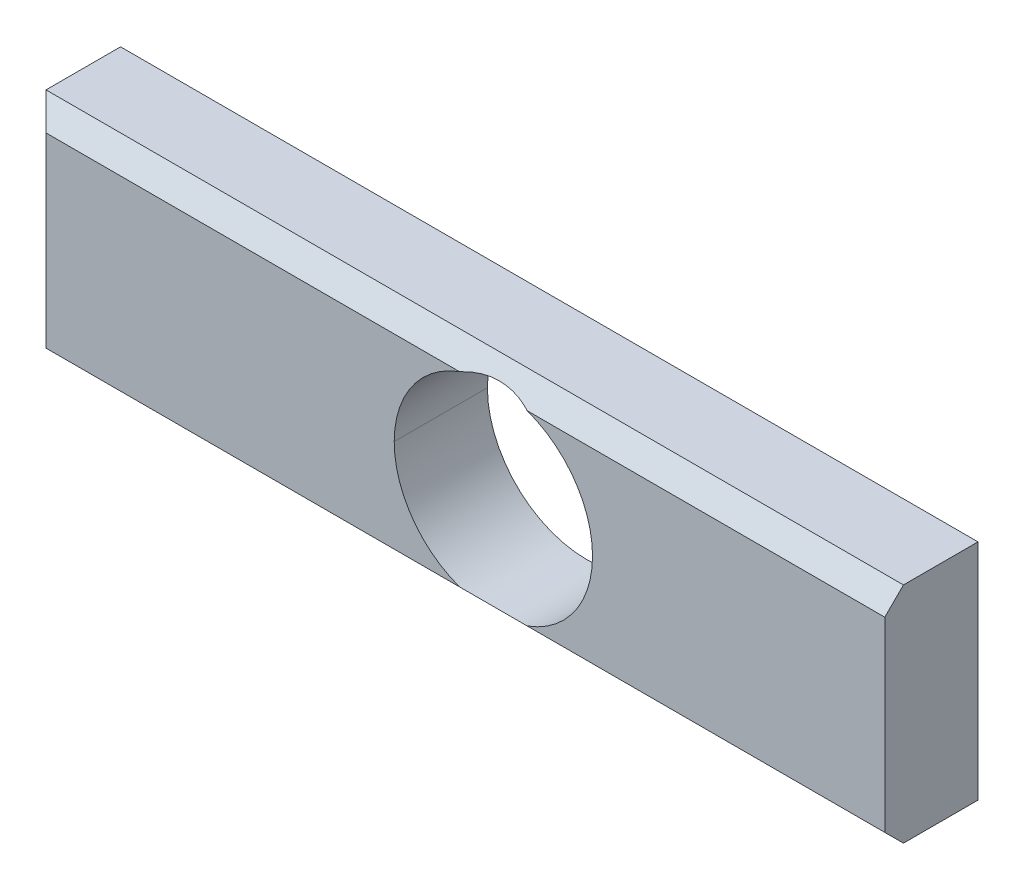
ISO-10303-21;
HEADER;
FILE_DESCRIPTION(('STEP AP214'),'2;1');
FILE_NAME('part.step','',(''),(''),'','','');
FILE_SCHEMA(('AUTOMOTIVE_DESIGN { 1 0 10303 214 1 1 1 1 }'));
ENDSEC;
DATA;
#1=APPLICATION_CONTEXT('core data for automotive mechanical design processes');
#2=APPLICATION_PROTOCOL_DEFINITION('international standard','automotive_design',2000,#1);
#3=PRODUCT_CONTEXT('',#1,'mechanical');
#4=PRODUCT('Part','Part','',(#3));
#5=PRODUCT_RELATED_PRODUCT_CATEGORY('part','',(#4));
#6=PRODUCT_DEFINITION_FORMATION('','',#4);
#7=PRODUCT_DEFINITION_CONTEXT('part definition',#1,'design');
#8=PRODUCT_DEFINITION('design','',#6,#7);
#9=PRODUCT_DEFINITION_SHAPE('','',#8);
#10=(LENGTH_UNIT() NAMED_UNIT(*) SI_UNIT(.MILLI.,.METRE.));
#11=(NAMED_UNIT(*) PLANE_ANGLE_UNIT() SI_UNIT($,.RADIAN.));
#12=(NAMED_UNIT(*) SI_UNIT($,.STERADIAN.) SOLID_ANGLE_UNIT());
#13=UNCERTAINTY_MEASURE_WITH_UNIT(LENGTH_MEASURE(1.E-05),#10,'distance_accuracy_value','');
#14=(GEOMETRIC_REPRESENTATION_CONTEXT(3) GLOBAL_UNCERTAINTY_ASSIGNED_CONTEXT((#13)) GLOBAL_UNIT_ASSIGNED_CONTEXT((#10,
#11,#12)) REPRESENTATION_CONTEXT('',''));
#15=CARTESIAN_POINT('',(0.,0.,0.));
#16=DIRECTION('',(0.,0.,1.));
#17=DIRECTION('',(1.,0.,0.));
#18=AXIS2_PLACEMENT_3D('',#15,#16,#17);
#19=CARTESIAN_POINT('',(0.,0.,7.9375));
#20=DIRECTION('',(0.,0.,-1.));
#21=DIRECTION('',(-1.,0.,0.));
#22=AXIS2_PLACEMENT_3D('',#19,#20,#21);
#23=CYLINDRICAL_SURFACE('',#22,8.4455);
#24=DIRECTION('',(0.,0.,-1.));
#25=VECTOR('',#24,1.);
#26=CARTESIAN_POINT('',(8.4455,0.,7.9375));
#27=LINE('',#26,#25);
#28=CARTESIAN_POINT('',(8.4455,0.,7.9375));
#29=VERTEX_POINT('',#28);
#30=CARTESIAN_POINT('',(8.4455,0.,0.));
#31=VERTEX_POINT('',#30);
#32=EDGE_CURVE('E210',#29,#31,#27,.T.);
#33=ORIENTED_EDGE('',*,*,#32,.F.);
#34=CARTESIAN_POINT('',(0.,0.,7.9375));
#35=DIRECTION('',(0.,0.,1.));
#36=DIRECTION('',(1.,0.,0.));
#37=AXIS2_PLACEMENT_3D('',#34,#35,#36);
#38=CIRCLE('',#37,8.4455);
#39=CARTESIAN_POINT('',(2.88488543966654,7.9375,7.9375));
#40=VERTEX_POINT('',#39);
#41=EDGE_CURVE('E148',#29,#40,#38,.T.);
#42=ORIENTED_EDGE('',*,*,#41,.T.);
#43=CARTESIAN_POINT('',(-2.88488543966654,7.9375,7.9375));
#44=CARTESIAN_POINT('',(-1.00180094902259,8.62190731070496,7.25309268929503));
#45=CARTESIAN_POINT('',(1.00180094902259,8.62190731070496,7.25309268929503));
#46=CARTESIAN_POINT('',(2.88488543966654,7.9375,7.9375));
#47=(BOUNDED_CURVE() B_SPLINE_CURVE(3,(#43,#44,#45,#46),.UNSPECIFIED.,.F.,
.F.) B_SPLINE_CURVE_WITH_KNOTS((4,4),(5.93457879350638,6.63179182085279),
.UNSPECIFIED.) CURVE() GEOMETRIC_REPRESENTATION_ITEM() RATIONAL_B_SPLINE_CURVE((1.,
0.959899749373433,0.959899749373433,1.)) REPRESENTATION_ITEM(''));
#48=CARTESIAN_POINT('',(-2.88488543966654,7.9375,7.9375));
#49=VERTEX_POINT('',#48);
#50=EDGE_CURVE('E142',#49,#40,#47,.T.);
#51=ORIENTED_EDGE('',*,*,#50,.F.);
#52=CARTESIAN_POINT('',(0.,0.,7.9375));
#53=DIRECTION('',(0.,0.,1.));
#54=DIRECTION('',(1.,0.,0.));
#55=AXIS2_PLACEMENT_3D('',#52,#53,#54);
#56=CIRCLE('',#55,8.4455);
#57=CARTESIAN_POINT('',(-8.4455,0.,7.9375));
#58=VERTEX_POINT('',#57);
#59=EDGE_CURVE('E146',#49,#58,#56,.T.);
#60=ORIENTED_EDGE('',*,*,#59,.T.);
#61=DIRECTION('',(0.,0.,-1.));
#62=VECTOR('',#61,1.);
#63=CARTESIAN_POINT('',(-8.4455,0.,7.9375));
#64=LINE('',#63,#62);
#65=CARTESIAN_POINT('',(-8.4455,0.,0.));
#66=VERTEX_POINT('',#65);
#67=EDGE_CURVE('E200',#58,#66,#64,.T.);
#68=ORIENTED_EDGE('',*,*,#67,.T.);
#69=CARTESIAN_POINT('',(0.,0.,0.));
#70=DIRECTION('',(0.,0.,1.));
#71=DIRECTION('',(1.,0.,0.));
#72=AXIS2_PLACEMENT_3D('',#69,#70,#71);
#73=CIRCLE('',#72,8.4455);
#74=EDGE_CURVE('E246',#31,#66,#73,.T.);
#75=ORIENTED_EDGE('',*,*,#74,.F.);
#76=EDGE_LOOP('',(#33,#42,#51,#60,#68,#75));
#77=FACE_BOUND('',#76,.T.);
#78=ADVANCED_FACE('F16',(#77),#23,.F.);
#79=CARTESIAN_POINT('',(-39.6875,-9.525,7.9375));
#80=DIRECTION('',(0.707106781186549,0.707106781186546,0.));
#81=DIRECTION('',(0.,0.,-1.));
#82=AXIS2_PLACEMENT_3D('',#79,#80,#81);
#83=PLANE('',#82);
#84=DIRECTION('',(0.577350269189624,-0.577350269189626,0.577350269189627));
#85=VECTOR('',#84,1.);
#86=CARTESIAN_POINT('',(-41.8041666666667,-7.40833333333333,4.23333333333332));
#87=LINE('',#86,#85);
#88=CARTESIAN_POINT('',(-41.275,-7.9375,4.7625));
#89=VERTEX_POINT('',#88);
#90=CARTESIAN_POINT('',(-39.6875,-9.525,6.35));
#91=VERTEX_POINT('',#90);
#92=EDGE_CURVE('E11',#89,#91,#87,.T.);
#93=ORIENTED_EDGE('',*,*,#92,.F.);
#94=DIRECTION('',(0.,0.,1.));
#95=VECTOR('',#94,1.);
#96=CARTESIAN_POINT('',(-41.275,-7.9375,7.9375));
#97=LINE('',#96,#95);
#98=CARTESIAN_POINT('',(-41.275,-7.9375,0.));
#99=VERTEX_POINT('',#98);
#100=EDGE_CURVE('E236',#99,#89,#97,.T.);
#101=ORIENTED_EDGE('',*,*,#100,.F.);
#102=DIRECTION('',(-0.707106781186546,0.707106781186549,0.));
#103=VECTOR('',#102,1.);
#104=CARTESIAN_POINT('',(-39.6875,-9.525,0.));
#105=LINE('',#104,#103);
#106=CARTESIAN_POINT('',(-39.6875,-9.525,0.));
#107=VERTEX_POINT('',#106);
#108=EDGE_CURVE('E42',#107,#99,#105,.T.);
#109=ORIENTED_EDGE('',*,*,#108,.F.);
#110=DIRECTION('',(0.,0.,-1.));
#111=VECTOR('',#110,1.);
#112=CARTESIAN_POINT('',(-39.6875,-9.525,7.9375));
#113=LINE('',#112,#111);
#114=EDGE_CURVE('E20',#91,#107,#113,.T.);
#115=ORIENTED_EDGE('',*,*,#114,.F.);
#116=EDGE_LOOP('',(#93,#101,#109,#115));
#117=FACE_BOUND('',#116,.T.);
#118=ADVANCED_FACE('F305',(#117),#83,.F.);
#119=CARTESIAN_POINT('',(-41.275,7.9375,7.9375));
#120=DIRECTION('',(0.707106781186545,-0.707106781186551,0.));
#121=DIRECTION('',(0.,0.,-1.));
#122=AXIS2_PLACEMENT_3D('',#119,#120,#121);
#123=PLANE('',#122);
#124=DIRECTION('',(-0.577350269189627,-0.577350269189621,-0.57735026918963));
#125=VECTOR('',#124,1.);
#126=CARTESIAN_POINT('',(-41.8041666666666,7.40833333333337,4.23333333333335));
#127=LINE('',#126,#125);
#128=CARTESIAN_POINT('',(-39.6875,9.525,6.35));
#129=VERTEX_POINT('',#128);
#130=CARTESIAN_POINT('',(-41.275,7.9375,4.7625));
#131=VERTEX_POINT('',#130);
#132=EDGE_CURVE('E27',#129,#131,#127,.T.);
#133=ORIENTED_EDGE('',*,*,#132,.F.);
#134=DIRECTION('',(0.,0.,1.));
#135=VECTOR('',#134,1.);
#136=CARTESIAN_POINT('',(-39.6875,9.525,7.9375));
#137=LINE('',#136,#135);
#138=CARTESIAN_POINT('',(-39.6875,9.525,0.));
#139=VERTEX_POINT('',#138);
#140=EDGE_CURVE('E225',#139,#129,#137,.T.);
#141=ORIENTED_EDGE('',*,*,#140,.F.);
#142=DIRECTION('',(0.707106781186551,0.707106781186545,0.));
#143=VECTOR('',#142,1.);
#144=CARTESIAN_POINT('',(-41.275,7.9375,0.));
#145=LINE('',#144,#143);
#146=CARTESIAN_POINT('',(-41.275,7.9375,0.));
#147=VERTEX_POINT('',#146);
#148=EDGE_CURVE('E79',#147,#139,#145,.T.);
#149=ORIENTED_EDGE('',*,*,#148,.F.);
#150=DIRECTION('',(0.,0.,-1.));
#151=VECTOR('',#150,1.);
#152=CARTESIAN_POINT('',(-41.275,7.9375,7.9375));
#153=LINE('',#152,#151);
#154=EDGE_CURVE('E201',#131,#147,#153,.T.);
#155=ORIENTED_EDGE('',*,*,#154,.F.);
#156=EDGE_LOOP('',(#133,#141,#149,#155));
#157=FACE_BOUND('',#156,.T.);
#158=ADVANCED_FACE('F304',(#157),#123,.F.);
#159=CARTESIAN_POINT('',(-38.1,0.,7.9375));
#160=DIRECTION('',(-0.70710678118655,0.,0.707106781186546));
#161=DIRECTION('',(0.,1.,0.));
#162=AXIS2_PLACEMENT_3D('',#159,#160,#161);
#163=PLANE('',#162);
#164=DIRECTION('',(-0.577350269189625,0.577350269189624,-0.577350269189628));
#165=VECTOR('',#164,1.);
#166=CARTESIAN_POINT('',(-35.4541666666667,5.29166666666669,10.5833333333333));
#167=LINE('',#166,#165);
#168=CARTESIAN_POINT('',(-38.1,7.9375,7.9375));
#169=VERTEX_POINT('',#168);
#170=EDGE_CURVE('E133',#169,#129,#167,.T.);
#171=ORIENTED_EDGE('',*,*,#170,.T.);
#172=ORIENTED_EDGE('',*,*,#132,.T.);
#173=DIRECTION('',(0.,1.,0.));
#174=VECTOR('',#173,1.);
#175=CARTESIAN_POINT('',(-41.275,9.525,4.7625));
#176=LINE('',#175,#174);
#177=EDGE_CURVE('E206',#89,#131,#176,.T.);
#178=ORIENTED_EDGE('',*,*,#177,.F.);
#179=ORIENTED_EDGE('',*,*,#92,.T.);
#180=DIRECTION('',(0.577350269189625,0.577350269189623,0.577350269189629));
#181=VECTOR('',#180,1.);
#182=CARTESIAN_POINT('',(-35.4541666666667,-5.29166666666668,10.5833333333333));
#183=LINE('',#182,#181);
#184=CARTESIAN_POINT('',(-38.1,-7.9375,7.9375));
#185=VERTEX_POINT('',#184);
#186=EDGE_CURVE('E226',#91,#185,#183,.T.);
#187=ORIENTED_EDGE('',*,*,#186,.T.);
#188=DIRECTION('',(0.,-1.,0.));
#189=VECTOR('',#188,1.);
#190=CARTESIAN_POINT('',(-38.1,-9.525,7.9375));
#191=LINE('',#190,#189);
#192=EDGE_CURVE('E153',#169,#185,#191,.T.);
#193=ORIENTED_EDGE('',*,*,#192,.F.);
#194=EDGE_LOOP('',(#171,#172,#178,#179,#187,#193));
#195=FACE_BOUND('',#194,.T.);
#196=ADVANCED_FACE('F302',(#195),#163,.T.);
#197=CARTESIAN_POINT('',(0.,0.,0.));
#198=DIRECTION('',(0.,0.,1.));
#199=DIRECTION('',(1.,0.,0.));
#200=AXIS2_PLACEMENT_3D('',#197,#198,#199);
#201=PLANE('',#200);
#202=CARTESIAN_POINT('',(0.,0.,0.));
#203=DIRECTION('',(0.,0.,1.));
#204=DIRECTION('',(1.,0.,0.));
#205=AXIS2_PLACEMENT_3D('',#202,#203,#204);
#206=CIRCLE('',#205,8.4455);
#207=EDGE_CURVE('E209',#66,#31,#206,.T.);
#208=ORIENTED_EDGE('',*,*,#207,.T.);
#209=ORIENTED_EDGE('',*,*,#74,.T.);
#210=EDGE_LOOP('',(#208,#209));
#211=FACE_BOUND('',#210,.T.);
#212=DIRECTION('',(0.,-1.,0.));
#213=VECTOR('',#212,1.);
#214=CARTESIAN_POINT('',(-41.275,9.525,0.));
#215=LINE('',#214,#213);
#216=EDGE_CURVE('E205',#147,#99,#215,.T.);
#217=ORIENTED_EDGE('',*,*,#216,.F.);
#218=ORIENTED_EDGE('',*,*,#148,.T.);
#219=DIRECTION('',(-1.,0.,0.));
#220=VECTOR('',#219,1.);
#221=CARTESIAN_POINT('',(-41.275,9.525,0.));
#222=LINE('',#221,#220);
#223=CARTESIAN_POINT('',(33.3375,9.525,0.));
#224=VERTEX_POINT('',#223);
#225=EDGE_CURVE('E181',#224,#139,#222,.T.);
#226=ORIENTED_EDGE('',*,*,#225,.F.);
#227=DIRECTION('',(0.,1.,0.));
#228=VECTOR('',#227,1.);
#229=CARTESIAN_POINT('',(33.3375,9.525,0.));
#230=LINE('',#229,#228);
#231=CARTESIAN_POINT('',(33.3375,-9.525,0.));
#232=VERTEX_POINT('',#231);
#233=EDGE_CURVE('E178',#232,#224,#230,.T.);
#234=ORIENTED_EDGE('',*,*,#233,.F.);
#235=DIRECTION('',(1.,0.,0.));
#236=VECTOR('',#235,1.);
#237=CARTESIAN_POINT('',(-41.275,-9.525,0.));
#238=LINE('',#237,#236);
#239=EDGE_CURVE('E91',#107,#232,#238,.T.);
#240=ORIENTED_EDGE('',*,*,#239,.F.);
#241=ORIENTED_EDGE('',*,*,#108,.T.);
#242=EDGE_LOOP('',(#217,#218,#226,#234,#240,#241));
#243=FACE_BOUND('',#242,.T.);
#244=ADVANCED_FACE('F18',(#211,#243),#201,.F.);
#245=CARTESIAN_POINT('',(0.,0.,7.9375));
#246=DIRECTION('',(0.,0.,1.));
#247=DIRECTION('',(1.,0.,0.));
#248=AXIS2_PLACEMENT_3D('',#245,#246,#247);
#249=PLANE('',#248);
#250=DIRECTION('',(-1.,0.,0.));
#251=VECTOR('',#250,1.);
#252=CARTESIAN_POINT('',(-38.1,7.9375,7.9375));
#253=LINE('',#252,#251);
#254=CARTESIAN_POINT('',(33.3375,7.9375,7.9375));
#255=VERTEX_POINT('',#254);
#256=EDGE_CURVE('E152',#255,#40,#253,.T.);
#257=ORIENTED_EDGE('',*,*,#256,.T.);
#258=ORIENTED_EDGE('',*,*,#41,.F.);
#259=CARTESIAN_POINT('',(0.,0.,7.9375));
#260=DIRECTION('',(0.,0.,1.));
#261=DIRECTION('',(1.,0.,0.));
#262=AXIS2_PLACEMENT_3D('',#259,#260,#261);
#263=CIRCLE('',#262,8.4455);
#264=CARTESIAN_POINT('',(2.88488543966653,-7.9375,7.9375));
#265=VERTEX_POINT('',#264);
#266=EDGE_CURVE('E214',#265,#29,#263,.T.);
#267=ORIENTED_EDGE('',*,*,#266,.F.);
#268=DIRECTION('',(1.,0.,0.));
#269=VECTOR('',#268,1.);
#270=CARTESIAN_POINT('',(33.3375,-7.9375,7.9375));
#271=LINE('',#270,#269);
#272=CARTESIAN_POINT('',(33.3375,-7.9375,7.9375));
#273=VERTEX_POINT('',#272);
#274=EDGE_CURVE('E230',#265,#273,#271,.T.);
#275=ORIENTED_EDGE('',*,*,#274,.T.);
#276=DIRECTION('',(0.,1.,0.));
#277=VECTOR('',#276,1.);
#278=CARTESIAN_POINT('',(33.3375,9.525,7.9375));
#279=LINE('',#278,#277);
#280=EDGE_CURVE('E221',#273,#255,#279,.T.);
#281=ORIENTED_EDGE('',*,*,#280,.T.);
#282=EDGE_LOOP('',(#257,#258,#267,#275,#281));
#283=FACE_BOUND('',#282,.T.);
#284=ADVANCED_FACE('F401',(#283),#249,.T.);
#285=CARTESIAN_POINT('',(-41.275,-9.525,7.9375));
#286=DIRECTION('',(0.,1.,0.));
#287=DIRECTION('',(1.,0.,0.));
#288=AXIS2_PLACEMENT_3D('',#285,#286,#287);
#289=PLANE('',#288);
#290=DIRECTION('',(-1.,0.,0.));
#291=VECTOR('',#290,1.);
#292=CARTESIAN_POINT('',(-38.1,-9.525,6.35));
#293=LINE('',#292,#291);
#294=CARTESIAN_POINT('',(33.3375,-9.525,6.35));
#295=VERTEX_POINT('',#294);
#296=EDGE_CURVE('E229',#295,#91,#293,.T.);
#297=ORIENTED_EDGE('',*,*,#296,.T.);
#298=ORIENTED_EDGE('',*,*,#114,.T.);
#299=ORIENTED_EDGE('',*,*,#239,.T.);
#300=DIRECTION('',(0.,0.,-1.));
#301=VECTOR('',#300,1.);
#302=CARTESIAN_POINT('',(33.3375,-9.525,7.9375));
#303=LINE('',#302,#301);
#304=EDGE_CURVE('E182',#295,#232,#303,.T.);
#305=ORIENTED_EDGE('',*,*,#304,.F.);
#306=EDGE_LOOP('',(#297,#298,#299,#305));
#307=FACE_BOUND('',#306,.T.);
#308=ADVANCED_FACE('F393',(#307),#289,.F.);
#309=CARTESIAN_POINT('',(-41.275,9.525,7.9375));
#310=DIRECTION('',(1.,0.,0.));
#311=DIRECTION('',(0.,-1.,0.));
#312=AXIS2_PLACEMENT_3D('',#309,#310,#311);
#313=PLANE('',#312);
#314=ORIENTED_EDGE('',*,*,#177,.T.);
#315=ORIENTED_EDGE('',*,*,#154,.T.);
#316=ORIENTED_EDGE('',*,*,#216,.T.);
#317=ORIENTED_EDGE('',*,*,#100,.T.);
#318=EDGE_LOOP('',(#314,#315,#316,#317));
#319=FACE_BOUND('',#318,.T.);
#320=ADVANCED_FACE('F299',(#319),#313,.F.);
#321=CARTESIAN_POINT('',(-41.275,9.525,7.9375));
#322=DIRECTION('',(0.,-1.,0.));
#323=DIRECTION('',(-1.,0.,0.));
#324=AXIS2_PLACEMENT_3D('',#321,#322,#323);
#325=PLANE('',#324);
#326=ORIENTED_EDGE('',*,*,#225,.T.);
#327=ORIENTED_EDGE('',*,*,#140,.T.);
#328=DIRECTION('',(1.,0.,0.));
#329=VECTOR('',#328,1.);
#330=CARTESIAN_POINT('',(33.3375,9.525,6.35));
#331=LINE('',#330,#329);
#332=CARTESIAN_POINT('',(33.3375,9.525,6.35));
#333=VERTEX_POINT('',#332);
#334=EDGE_CURVE('E184',#129,#333,#331,.T.);
#335=ORIENTED_EDGE('',*,*,#334,.T.);
#336=DIRECTION('',(0.,0.,-1.));
#337=VECTOR('',#336,1.);
#338=CARTESIAN_POINT('',(33.3375,9.525,7.9375));
#339=LINE('',#338,#337);
#340=EDGE_CURVE('E235',#333,#224,#339,.T.);
#341=ORIENTED_EDGE('',*,*,#340,.T.);
#342=EDGE_LOOP('',(#326,#327,#335,#341));
#343=FACE_BOUND('',#342,.T.);
#344=ADVANCED_FACE('F330',(#343),#325,.F.);
#345=CARTESIAN_POINT('',(33.3375,9.525,7.9375));
#346=DIRECTION('',(-1.,0.,0.));
#347=DIRECTION('',(0.,0.,1.));
#348=AXIS2_PLACEMENT_3D('',#345,#346,#347);
#349=PLANE('',#348);
#350=ORIENTED_EDGE('',*,*,#340,.F.);
#351=DIRECTION('',(0.,-0.707106781186545,0.70710678118655));
#352=VECTOR('',#351,1.);
#353=CARTESIAN_POINT('',(33.3375,7.9375,7.9375));
#354=LINE('',#353,#352);
#355=EDGE_CURVE('E188',#333,#255,#354,.T.);
#356=ORIENTED_EDGE('',*,*,#355,.T.);
#357=ORIENTED_EDGE('',*,*,#280,.F.);
#358=DIRECTION('',(0.,-0.707106781186545,-0.707106781186551));
#359=VECTOR('',#358,1.);
#360=CARTESIAN_POINT('',(33.3375,-7.9375,7.9375));
#361=LINE('',#360,#359);
#362=EDGE_CURVE('E231',#273,#295,#361,.T.);
#363=ORIENTED_EDGE('',*,*,#362,.T.);
#364=ORIENTED_EDGE('',*,*,#304,.T.);
#365=ORIENTED_EDGE('',*,*,#233,.T.);
#366=EDGE_LOOP('',(#350,#356,#357,#363,#364,#365));
#367=FACE_BOUND('',#366,.T.);
#368=ADVANCED_FACE('F324',(#367),#349,.F.);
#369=CARTESIAN_POINT('',(0.,-7.9375,7.9375));
#370=DIRECTION('',(0.,-0.707106781186551,0.707106781186545));
#371=DIRECTION('',(-1.,0.,0.));
#372=AXIS2_PLACEMENT_3D('',#369,#370,#371);
#373=PLANE('',#372);
#374=ORIENTED_EDGE('',*,*,#274,.F.);
#375=CARTESIAN_POINT('',(2.88488543966653,-7.9375,7.9375));
#376=CARTESIAN_POINT('',(1.00180094902258,-8.62190731070496,7.25309268929503));
#377=CARTESIAN_POINT('',(-1.00180094902258,-8.62190731070496,7.25309268929503));
#378=CARTESIAN_POINT('',(-2.88488543966653,-7.9375,7.9375));
#379=(BOUNDED_CURVE() B_SPLINE_CURVE(3,(#375,#376,#377,#378),.UNSPECIFIED.,.F.,
.F.) B_SPLINE_CURVE_WITH_KNOTS((4,4),(5.93457879350638,6.63179182085279),
.UNSPECIFIED.) CURVE() GEOMETRIC_REPRESENTATION_ITEM() RATIONAL_B_SPLINE_CURVE((1.,
0.959899749373434,0.959899749373434,1.)) REPRESENTATION_ITEM(''));
#380=CARTESIAN_POINT('',(-2.88488543966653,-7.9375,7.9375));
#381=VERTEX_POINT('',#380);
#382=EDGE_CURVE('E173',#265,#381,#379,.T.);
#383=ORIENTED_EDGE('',*,*,#382,.T.);
#384=DIRECTION('',(1.,0.,0.));
#385=VECTOR('',#384,1.);
#386=CARTESIAN_POINT('',(33.3375,-7.9375,7.9375));
#387=LINE('',#386,#385);
#388=EDGE_CURVE('E167',#185,#381,#387,.T.);
#389=ORIENTED_EDGE('',*,*,#388,.F.);
#390=ORIENTED_EDGE('',*,*,#186,.F.);
#391=ORIENTED_EDGE('',*,*,#296,.F.);
#392=ORIENTED_EDGE('',*,*,#362,.F.);
#393=EDGE_LOOP('',(#374,#383,#389,#390,#391,#392));
#394=FACE_BOUND('',#393,.T.);
#395=ADVANCED_FACE('F318',(#394),#373,.T.);
#396=CARTESIAN_POINT('',(0.,7.9375,7.9375));
#397=DIRECTION('',(0.,0.70710678118655,0.707106781186545));
#398=DIRECTION('',(1.,0.,0.));
#399=AXIS2_PLACEMENT_3D('',#396,#397,#398);
#400=PLANE('',#399);
#401=DIRECTION('',(-1.,0.,0.));
#402=VECTOR('',#401,1.);
#403=CARTESIAN_POINT('',(-38.1,7.9375,7.9375));
#404=LINE('',#403,#402);
#405=EDGE_CURVE('E156',#49,#169,#404,.T.);
#406=ORIENTED_EDGE('',*,*,#405,.F.);
#407=ORIENTED_EDGE('',*,*,#50,.T.);
#408=ORIENTED_EDGE('',*,*,#256,.F.);
#409=ORIENTED_EDGE('',*,*,#355,.F.);
#410=ORIENTED_EDGE('',*,*,#334,.F.);
#411=ORIENTED_EDGE('',*,*,#170,.F.);
#412=EDGE_LOOP('',(#406,#407,#408,#409,#410,#411));
#413=FACE_BOUND('',#412,.T.);
#414=ADVANCED_FACE('F157',(#413),#400,.T.);
#415=CARTESIAN_POINT('',(0.,0.,7.9375));
#416=DIRECTION('',(0.,0.,1.));
#417=DIRECTION('',(1.,0.,0.));
#418=AXIS2_PLACEMENT_3D('',#415,#416,#417);
#419=PLANE('',#418);
#420=ORIENTED_EDGE('',*,*,#388,.T.);
#421=CARTESIAN_POINT('',(0.,0.,7.9375));
#422=DIRECTION('',(0.,0.,1.));
#423=DIRECTION('',(1.,0.,0.));
#424=AXIS2_PLACEMENT_3D('',#421,#422,#423);
#425=CIRCLE('',#424,8.4455);
#426=EDGE_CURVE('E164',#58,#381,#425,.T.);
#427=ORIENTED_EDGE('',*,*,#426,.F.);
#428=ORIENTED_EDGE('',*,*,#59,.F.);
#429=ORIENTED_EDGE('',*,*,#405,.T.);
#430=ORIENTED_EDGE('',*,*,#192,.T.);
#431=EDGE_LOOP('',(#420,#427,#428,#429,#430));
#432=FACE_BOUND('',#431,.T.);
#433=ADVANCED_FACE('F162',(#432),#419,.T.);
#434=CARTESIAN_POINT('',(0.,0.,7.9375));
#435=DIRECTION('',(0.,0.,-1.));
#436=DIRECTION('',(-1.,0.,0.));
#437=AXIS2_PLACEMENT_3D('',#434,#435,#436);
#438=CYLINDRICAL_SURFACE('',#437,8.4455);
#439=ORIENTED_EDGE('',*,*,#266,.T.);
#440=ORIENTED_EDGE('',*,*,#32,.T.);
#441=ORIENTED_EDGE('',*,*,#207,.F.);
#442=ORIENTED_EDGE('',*,*,#67,.F.);
#443=ORIENTED_EDGE('',*,*,#426,.T.);
#444=ORIENTED_EDGE('',*,*,#382,.F.);
#445=EDGE_LOOP('',(#439,#440,#441,#442,#443,#444));
#446=FACE_BOUND('',#445,.T.);
#447=ADVANCED_FACE('F259',(#446),#438,.F.);
#448=CLOSED_SHELL('',(#78,#118,#158,#196,#244,#284,#308,#320,#344,#368,#395,#414,#433,#447));
#449=MANIFOLD_SOLID_BREP('B1',#448);
#450=ADVANCED_BREP_SHAPE_REPRESENTATION('',(#18,#449),#14);
#451=SHAPE_DEFINITION_REPRESENTATION(#9,#450);
ENDSEC;
END-ISO-10303-21;
